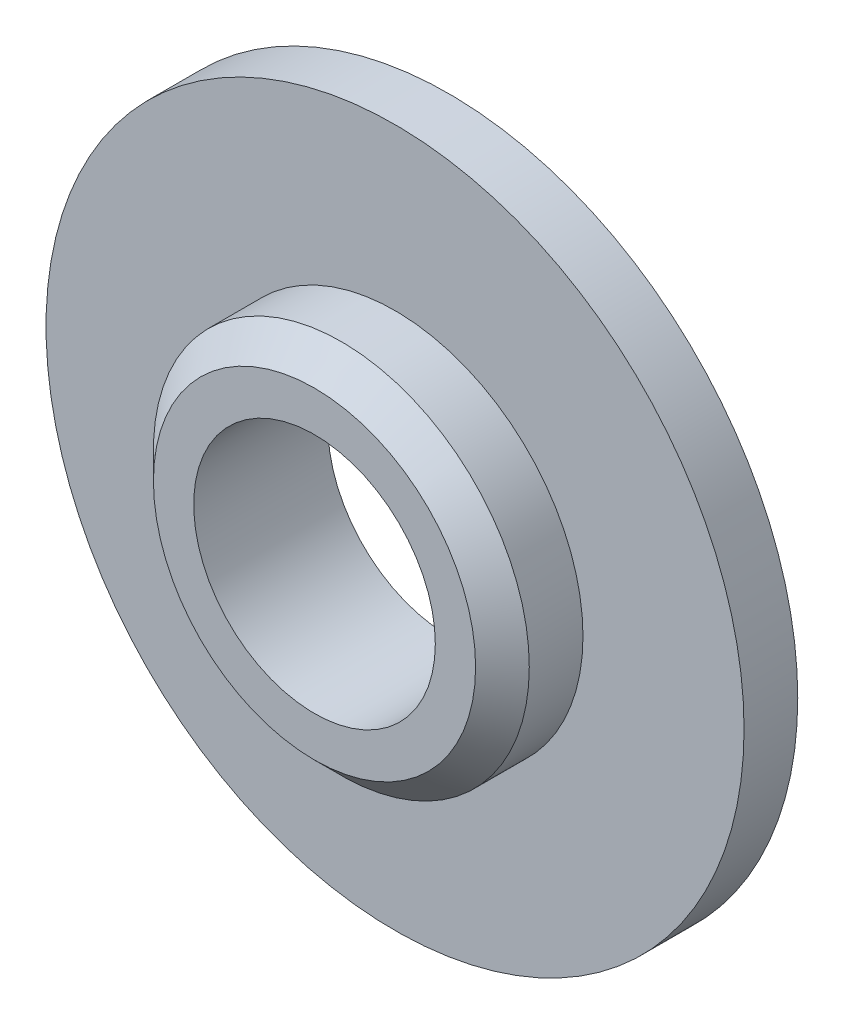
ISO-10303-21;
HEADER;
FILE_DESCRIPTION(('STEP AP214'),'2;1');
FILE_NAME('part.step','',(''),(''),'','','');
FILE_SCHEMA(('AUTOMOTIVE_DESIGN { 1 0 10303 214 1 1 1 1 }'));
ENDSEC;
DATA;
#1=APPLICATION_CONTEXT('core data for automotive mechanical design processes');
#2=APPLICATION_PROTOCOL_DEFINITION('international standard','automotive_design',2000,#1);
#3=PRODUCT_CONTEXT('',#1,'mechanical');
#4=PRODUCT('Part','Part','',(#3));
#5=PRODUCT_RELATED_PRODUCT_CATEGORY('part','',(#4));
#6=PRODUCT_DEFINITION_FORMATION('','',#4);
#7=PRODUCT_DEFINITION_CONTEXT('part definition',#1,'design');
#8=PRODUCT_DEFINITION('design','',#6,#7);
#9=PRODUCT_DEFINITION_SHAPE('','',#8);
#10=(LENGTH_UNIT() NAMED_UNIT(*) SI_UNIT(.MILLI.,.METRE.));
#11=(NAMED_UNIT(*) PLANE_ANGLE_UNIT() SI_UNIT($,.RADIAN.));
#12=(NAMED_UNIT(*) SI_UNIT($,.STERADIAN.) SOLID_ANGLE_UNIT());
#13=UNCERTAINTY_MEASURE_WITH_UNIT(LENGTH_MEASURE(1.E-05),#10,'distance_accuracy_value','');
#14=(GEOMETRIC_REPRESENTATION_CONTEXT(3) GLOBAL_UNCERTAINTY_ASSIGNED_CONTEXT((#13)) GLOBAL_UNIT_ASSIGNED_CONTEXT((#10,
#11,#12)) REPRESENTATION_CONTEXT('',''));
#15=CARTESIAN_POINT('',(0.,0.,0.));
#16=DIRECTION('',(0.,0.,1.));
#17=DIRECTION('',(1.,0.,0.));
#18=AXIS2_PLACEMENT_3D('',#15,#16,#17);
#19=CARTESIAN_POINT('',(0.,0.,2.));
#20=DIRECTION('',(0.,0.,1.));
#21=DIRECTION('',(1.,0.,0.));
#22=AXIS2_PLACEMENT_3D('',#19,#20,#21);
#23=PLANE('',#22);
#24=CARTESIAN_POINT('',(0.,0.,2.));
#25=DIRECTION('',(0.,0.,1.));
#26=DIRECTION('',(1.,0.,0.));
#27=AXIS2_PLACEMENT_3D('',#24,#25,#26);
#28=CIRCLE('',#27,7.);
#29=CARTESIAN_POINT('',(7.,0.,2.));
#30=VERTEX_POINT('',#29);
#31=EDGE_CURVE('E84',#30,#30,#28,.F.);
#32=ORIENTED_EDGE('',*,*,#31,.T.);
#33=EDGE_LOOP('',(#32));
#34=FACE_BOUND('',#33,.T.);
#35=CARTESIAN_POINT('',(0.,0.,2.));
#36=DIRECTION('',(0.,0.,1.));
#37=DIRECTION('',(1.,0.,0.));
#38=AXIS2_PLACEMENT_3D('',#35,#36,#37);
#39=CIRCLE('',#38,13.);
#40=CARTESIAN_POINT('',(13.,0.,2.));
#41=VERTEX_POINT('',#40);
#42=EDGE_CURVE('E68',#41,#41,#39,.T.);
#43=ORIENTED_EDGE('',*,*,#42,.T.);
#44=EDGE_LOOP('',(#43));
#45=FACE_BOUND('',#44,.T.);
#46=ADVANCED_FACE('F53',(#34,#45),#23,.T.);
#47=CARTESIAN_POINT('',(0.,0.,0.));
#48=DIRECTION('',(0.,0.,1.));
#49=DIRECTION('',(1.,0.,0.));
#50=AXIS2_PLACEMENT_3D('',#47,#48,#49);
#51=PLANE('',#50);
#52=CARTESIAN_POINT('',(0.,0.,0.));
#53=DIRECTION('',(0.,0.,1.));
#54=DIRECTION('',(1.,0.,0.));
#55=AXIS2_PLACEMENT_3D('',#52,#53,#54);
#56=CIRCLE('',#55,13.);
#57=CARTESIAN_POINT('',(13.,0.,0.));
#58=VERTEX_POINT('',#57);
#59=EDGE_CURVE('E74',#58,#58,#56,.T.);
#60=ORIENTED_EDGE('',*,*,#59,.F.);
#61=EDGE_LOOP('',(#60));
#62=FACE_BOUND('',#61,.T.);
#63=CARTESIAN_POINT('',(0.,0.,0.));
#64=DIRECTION('',(0.,0.,1.));
#65=DIRECTION('',(1.,0.,0.));
#66=AXIS2_PLACEMENT_3D('',#63,#64,#65);
#67=CIRCLE('',#66,4.5);
#68=CARTESIAN_POINT('',(4.5,0.,0.));
#69=VERTEX_POINT('',#68);
#70=EDGE_CURVE('E79',#69,#69,#67,.T.);
#71=ORIENTED_EDGE('',*,*,#70,.T.);
#72=EDGE_LOOP('',(#71));
#73=FACE_BOUND('',#72,.T.);
#74=ADVANCED_FACE('F107',(#62,#73),#51,.F.);
#75=CARTESIAN_POINT('',(0.,0.,2.));
#76=DIRECTION('',(0.,0.,-1.));
#77=DIRECTION('',(-1.,0.,0.));
#78=AXIS2_PLACEMENT_3D('',#75,#76,#77);
#79=CYLINDRICAL_SURFACE('',#78,13.);
#80=ORIENTED_EDGE('',*,*,#42,.F.);
#81=EDGE_LOOP('',(#80));
#82=FACE_BOUND('',#81,.T.);
#83=ORIENTED_EDGE('',*,*,#59,.T.);
#84=EDGE_LOOP('',(#83));
#85=FACE_BOUND('',#84,.T.);
#86=ADVANCED_FACE('F114',(#82,#85),#79,.T.);
#87=CARTESIAN_POINT('',(0.,0.,2.));
#88=DIRECTION('',(0.,0.,-1.));
#89=DIRECTION('',(-1.,0.,0.));
#90=AXIS2_PLACEMENT_3D('',#87,#88,#89);
#91=CYLINDRICAL_SURFACE('',#90,4.5);
#92=ORIENTED_EDGE('',*,*,#70,.F.);
#93=EDGE_LOOP('',(#92));
#94=FACE_BOUND('',#93,.T.);
#95=CARTESIAN_POINT('',(0.,0.,5.));
#96=DIRECTION('',(0.,0.,1.));
#97=DIRECTION('',(1.,0.,0.));
#98=AXIS2_PLACEMENT_3D('',#95,#96,#97);
#99=CIRCLE('',#98,4.5);
#100=CARTESIAN_POINT('',(4.5,0.,5.));
#101=VERTEX_POINT('',#100);
#102=EDGE_CURVE('E88',#101,#101,#99,.T.);
#103=ORIENTED_EDGE('',*,*,#102,.T.);
#104=EDGE_LOOP('',(#103));
#105=FACE_BOUND('',#104,.T.);
#106=ADVANCED_FACE('F94',(#94,#105),#91,.F.);
#107=CARTESIAN_POINT('',(0.,0.,5.));
#108=DIRECTION('',(0.,0.,-1.));
#109=DIRECTION('',(-1.,0.,0.));
#110=AXIS2_PLACEMENT_3D('',#107,#108,#109);
#111=CYLINDRICAL_SURFACE('',#110,7.);
#112=CARTESIAN_POINT('',(0.,0.,3.99999999999999));
#113=DIRECTION('',(0.,0.,1.));
#114=DIRECTION('',(1.,0.,0.));
#115=AXIS2_PLACEMENT_3D('',#112,#113,#114);
#116=CIRCLE('',#115,7.);
#117=CARTESIAN_POINT('',(7.,0.,3.99999999999999));
#118=VERTEX_POINT('',#117);
#119=EDGE_CURVE('E11',#118,#118,#116,.F.);
#120=ORIENTED_EDGE('',*,*,#119,.T.);
#121=EDGE_LOOP('',(#120));
#122=FACE_BOUND('',#121,.T.);
#123=ORIENTED_EDGE('',*,*,#31,.F.);
#124=EDGE_LOOP('',(#123));
#125=FACE_BOUND('',#124,.T.);
#126=ADVANCED_FACE('F98',(#122,#125),#111,.T.);
#127=CARTESIAN_POINT('',(0.,0.,5.));
#128=DIRECTION('',(0.,0.,1.));
#129=DIRECTION('',(1.,0.,0.));
#130=AXIS2_PLACEMENT_3D('',#127,#128,#129);
#131=PLANE('',#130);
#132=CARTESIAN_POINT('',(0.,0.,5.));
#133=DIRECTION('',(0.,0.,1.));
#134=DIRECTION('',(1.,0.,0.));
#135=AXIS2_PLACEMENT_3D('',#132,#133,#134);
#136=CIRCLE('',#135,5.99999999999999);
#137=CARTESIAN_POINT('',(5.99999999999999,0.,5.));
#138=VERTEX_POINT('',#137);
#139=EDGE_CURVE('E62',#138,#138,#136,.T.);
#140=ORIENTED_EDGE('',*,*,#139,.T.);
#141=EDGE_LOOP('',(#140));
#142=FACE_BOUND('',#141,.T.);
#143=ORIENTED_EDGE('',*,*,#102,.F.);
#144=EDGE_LOOP('',(#143));
#145=FACE_BOUND('',#144,.T.);
#146=ADVANCED_FACE('F96',(#142,#145),#131,.T.);
#147=CARTESIAN_POINT('',(0.,0.,5.));
#148=DIRECTION('',(0.,0.,-1.));
#149=DIRECTION('',(-1.,0.,0.));
#150=AXIS2_PLACEMENT_3D('',#147,#148,#149);
#151=CONICAL_SURFACE('',#150,5.99999999999999,0.785398163397448);
#152=ORIENTED_EDGE('',*,*,#119,.F.);
#153=EDGE_LOOP('',(#152));
#154=FACE_BOUND('',#153,.T.);
#155=ORIENTED_EDGE('',*,*,#139,.F.);
#156=EDGE_LOOP('',(#155));
#157=FACE_BOUND('',#156,.T.);
#158=ADVANCED_FACE('F56',(#154,#157),#151,.T.);
#159=CLOSED_SHELL('',(#46,#74,#86,#106,#126,#146,#158));
#160=MANIFOLD_SOLID_BREP('B2',#159);
#161=ADVANCED_BREP_SHAPE_REPRESENTATION('',(#18,#160),#14);
#162=SHAPE_DEFINITION_REPRESENTATION(#9,#161);
ENDSEC;
END-ISO-10303-21;
